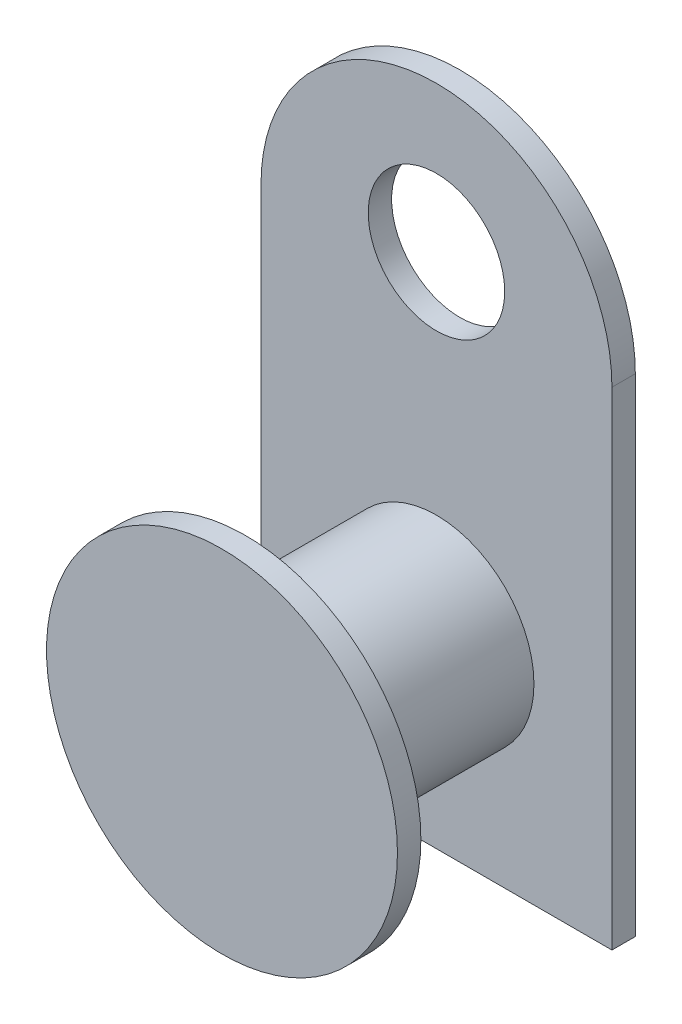
ISO-10303-21;
HEADER;
FILE_DESCRIPTION(('STEP AP214'),'2;1');
FILE_NAME('part.step','',(''),(''),'','','');
FILE_SCHEMA(('AUTOMOTIVE_DESIGN { 1 0 10303 214 1 1 1 1 }'));
ENDSEC;
DATA;
#1=APPLICATION_CONTEXT('core data for automotive mechanical design processes');
#2=APPLICATION_PROTOCOL_DEFINITION('international standard','automotive_design',2000,#1);
#3=PRODUCT_CONTEXT('',#1,'mechanical');
#4=PRODUCT('Part','Part','',(#3));
#5=PRODUCT_RELATED_PRODUCT_CATEGORY('part','',(#4));
#6=PRODUCT_DEFINITION_FORMATION('','',#4);
#7=PRODUCT_DEFINITION_CONTEXT('part definition',#1,'design');
#8=PRODUCT_DEFINITION('design','',#6,#7);
#9=PRODUCT_DEFINITION_SHAPE('','',#8);
#10=(LENGTH_UNIT() NAMED_UNIT(*) SI_UNIT(.MILLI.,.METRE.));
#11=(NAMED_UNIT(*) PLANE_ANGLE_UNIT() SI_UNIT($,.RADIAN.));
#12=(NAMED_UNIT(*) SI_UNIT($,.STERADIAN.) SOLID_ANGLE_UNIT());
#13=UNCERTAINTY_MEASURE_WITH_UNIT(LENGTH_MEASURE(1.E-05),#10,'distance_accuracy_value','');
#14=(GEOMETRIC_REPRESENTATION_CONTEXT(3) GLOBAL_UNCERTAINTY_ASSIGNED_CONTEXT((#13)) GLOBAL_UNIT_ASSIGNED_CONTEXT((#10,
#11,#12)) REPRESENTATION_CONTEXT('',''));
#15=CARTESIAN_POINT('',(0.,0.,0.));
#16=DIRECTION('',(0.,0.,1.));
#17=DIRECTION('',(1.,0.,0.));
#18=AXIS2_PLACEMENT_3D('',#15,#16,#17);
#19=CARTESIAN_POINT('',(0.,49.0988885855391,61.));
#20=DIRECTION('',(0.,0.,-1.));
#21=DIRECTION('',(-1.,0.,0.));
#22=AXIS2_PLACEMENT_3D('',#19,#20,#21);
#23=CYLINDRICAL_SURFACE('',#22,45.);
#24=CARTESIAN_POINT('',(0.,49.0988885855391,61.));
#25=DIRECTION('',(0.,0.,1.));
#26=DIRECTION('',(1.,0.,0.));
#27=AXIS2_PLACEMENT_3D('',#24,#25,#26);
#28=CIRCLE('',#27,45.);
#29=CARTESIAN_POINT('',(45.,49.0988885855391,61.));
#30=VERTEX_POINT('',#29);
#31=EDGE_CURVE('E11',#30,#30,#28,.T.);
#32=ORIENTED_EDGE('',*,*,#31,.F.);
#33=EDGE_LOOP('',(#32));
#34=FACE_BOUND('',#33,.T.);
#35=CARTESIAN_POINT('',(0.,49.0988885855391,55.));
#36=DIRECTION('',(0.,0.,1.));
#37=DIRECTION('',(1.,0.,0.));
#38=AXIS2_PLACEMENT_3D('',#35,#36,#37);
#39=CIRCLE('',#38,45.);
#40=CARTESIAN_POINT('',(45.,49.0988885855391,55.));
#41=VERTEX_POINT('',#40);
#42=EDGE_CURVE('E47',#41,#41,#39,.T.);
#43=ORIENTED_EDGE('',*,*,#42,.T.);
#44=EDGE_LOOP('',(#43));
#45=FACE_BOUND('',#44,.T.);
#46=ADVANCED_FACE('F44',(#34,#45),#23,.T.);
#47=CARTESIAN_POINT('',(0.,49.0988885855391,61.));
#48=DIRECTION('',(0.,0.,1.));
#49=DIRECTION('',(1.,0.,0.));
#50=AXIS2_PLACEMENT_3D('',#47,#48,#49);
#51=PLANE('',#50);
#52=ORIENTED_EDGE('',*,*,#31,.T.);
#53=EDGE_LOOP('',(#52));
#54=FACE_BOUND('',#53,.T.);
#55=ADVANCED_FACE('F59',(#54),#51,.T.);
#56=CARTESIAN_POINT('',(0.,49.0988885855391,55.));
#57=DIRECTION('',(0.,0.,1.));
#58=DIRECTION('',(1.,0.,0.));
#59=AXIS2_PLACEMENT_3D('',#56,#57,#58);
#60=PLANE('',#59);
#61=ORIENTED_EDGE('',*,*,#42,.F.);
#62=EDGE_LOOP('',(#61));
#63=FACE_BOUND('',#62,.T.);
#64=ADVANCED_FACE('F57',(#63),#60,.F.);
#65=CLOSED_SHELL('',(#46,#55,#64));
#66=MANIFOLD_SOLID_BREP('B2',#65);
#67=CARTESIAN_POINT('',(0.,49.0988885855391,58.));
#68=DIRECTION('',(0.,0.,1.));
#69=DIRECTION('',(1.,0.,0.));
#70=AXIS2_PLACEMENT_3D('',#67,#68,#69);
#71=PLANE('',#70);
#72=CARTESIAN_POINT('',(0.,49.0988885855391,58.));
#73=DIRECTION('',(0.,0.,1.));
#74=DIRECTION('',(1.,0.,0.));
#75=AXIS2_PLACEMENT_3D('',#72,#73,#74);
#76=CIRCLE('',#75,25.);
#77=CARTESIAN_POINT('',(25.,49.0988885855391,58.));
#78=VERTEX_POINT('',#77);
#79=EDGE_CURVE('E43',#78,#78,#76,.T.);
#80=ORIENTED_EDGE('',*,*,#79,.T.);
#81=EDGE_LOOP('',(#80));
#82=FACE_BOUND('',#81,.T.);
#83=CARTESIAN_POINT('',(0.,49.0988885855391,58.));
#84=DIRECTION('',(0.,0.,1.));
#85=DIRECTION('',(1.,0.,0.));
#86=AXIS2_PLACEMENT_3D('',#83,#84,#85);
#87=CIRCLE('',#86,22.);
#88=CARTESIAN_POINT('',(22.,49.0988885855391,58.));
#89=VERTEX_POINT('',#88);
#90=EDGE_CURVE('E105',#89,#89,#87,.T.);
#91=ORIENTED_EDGE('',*,*,#90,.F.);
#92=EDGE_LOOP('',(#91));
#93=FACE_BOUND('',#92,.T.);
#94=ADVANCED_FACE('F94',(#82,#93),#71,.T.);
#95=CARTESIAN_POINT('',(0.,49.0988885855391,3.));
#96=DIRECTION('',(0.,0.,1.));
#97=DIRECTION('',(1.,0.,0.));
#98=AXIS2_PLACEMENT_3D('',#95,#96,#97);
#99=PLANE('',#98);
#100=CARTESIAN_POINT('',(0.,49.0988885855391,3.));
#101=DIRECTION('',(0.,0.,1.));
#102=DIRECTION('',(1.,0.,0.));
#103=AXIS2_PLACEMENT_3D('',#100,#101,#102);
#104=CIRCLE('',#103,25.);
#105=CARTESIAN_POINT('',(25.,49.0988885855391,3.));
#106=VERTEX_POINT('',#105);
#107=EDGE_CURVE('E98',#106,#106,#104,.T.);
#108=ORIENTED_EDGE('',*,*,#107,.F.);
#109=EDGE_LOOP('',(#108));
#110=FACE_BOUND('',#109,.T.);
#111=CARTESIAN_POINT('',(0.,49.0988885855391,3.));
#112=DIRECTION('',(0.,0.,1.));
#113=DIRECTION('',(1.,0.,0.));
#114=AXIS2_PLACEMENT_3D('',#111,#112,#113);
#115=CIRCLE('',#114,22.);
#116=CARTESIAN_POINT('',(22.,49.0988885855391,3.));
#117=VERTEX_POINT('',#116);
#118=EDGE_CURVE('E107',#117,#117,#115,.T.);
#119=ORIENTED_EDGE('',*,*,#118,.T.);
#120=EDGE_LOOP('',(#119));
#121=FACE_BOUND('',#120,.T.);
#122=ADVANCED_FACE('F117',(#110,#121),#99,.F.);
#123=CARTESIAN_POINT('',(0.,49.0988885855391,58.));
#124=DIRECTION('',(0.,0.,-1.));
#125=DIRECTION('',(-1.,0.,0.));
#126=AXIS2_PLACEMENT_3D('',#123,#124,#125);
#127=CYLINDRICAL_SURFACE('',#126,25.);
#128=ORIENTED_EDGE('',*,*,#79,.F.);
#129=EDGE_LOOP('',(#128));
#130=FACE_BOUND('',#129,.T.);
#131=ORIENTED_EDGE('',*,*,#107,.T.);
#132=EDGE_LOOP('',(#131));
#133=FACE_BOUND('',#132,.T.);
#134=ADVANCED_FACE('F96',(#130,#133),#127,.T.);
#135=CARTESIAN_POINT('',(0.,49.0988885855391,58.));
#136=DIRECTION('',(0.,0.,-1.));
#137=DIRECTION('',(-1.,0.,0.));
#138=AXIS2_PLACEMENT_3D('',#135,#136,#137);
#139=CYLINDRICAL_SURFACE('',#138,22.);
#140=ORIENTED_EDGE('',*,*,#90,.T.);
#141=EDGE_LOOP('',(#140));
#142=FACE_BOUND('',#141,.T.);
#143=ORIENTED_EDGE('',*,*,#118,.F.);
#144=EDGE_LOOP('',(#143));
#145=FACE_BOUND('',#144,.T.);
#146=ADVANCED_FACE('F113',(#142,#145),#139,.F.);
#147=CLOSED_SHELL('',(#94,#122,#134,#146));
#148=MANIFOLD_SOLID_BREP('B6',#147);
#149=CARTESIAN_POINT('',(0.,125.,6.));
#150=DIRECTION('',(0.,0.,1.));
#151=DIRECTION('',(1.,0.,0.));
#152=AXIS2_PLACEMENT_3D('',#149,#150,#151);
#153=PLANE('',#152);
#154=CARTESIAN_POINT('',(0.,49.0988885855391,6.));
#155=DIRECTION('',(0.,0.,1.));
#156=DIRECTION('',(1.,0.,0.));
#157=AXIS2_PLACEMENT_3D('',#154,#155,#156);
#158=CIRCLE('',#157,25.);
#159=CARTESIAN_POINT('',(25.,49.0988885855391,6.));
#160=VERTEX_POINT('',#159);
#161=EDGE_CURVE('E240',#160,#160,#158,.T.);
#162=ORIENTED_EDGE('',*,*,#161,.F.);
#163=EDGE_LOOP('',(#162));
#164=FACE_BOUND('',#163,.T.);
#165=DIRECTION('',(0.,-1.,0.));
#166=VECTOR('',#165,1.);
#167=CARTESIAN_POINT('',(-45.,125.,6.));
#168=LINE('',#167,#166);
#169=CARTESIAN_POINT('',(-45.,125.,6.));
#170=VERTEX_POINT('',#169);
#171=CARTESIAN_POINT('',(-45.,0.,6.));
#172=VERTEX_POINT('',#171);
#173=EDGE_CURVE('E207',#170,#172,#168,.T.);
#174=ORIENTED_EDGE('',*,*,#173,.T.);
#175=DIRECTION('',(1.,0.,0.));
#176=VECTOR('',#175,1.);
#177=CARTESIAN_POINT('',(-45.,0.,6.));
#178=LINE('',#177,#176);
#179=CARTESIAN_POINT('',(45.,0.,6.));
#180=VERTEX_POINT('',#179);
#181=EDGE_CURVE('E202',#172,#180,#178,.T.);
#182=ORIENTED_EDGE('',*,*,#181,.T.);
#183=DIRECTION('',(0.,1.,0.));
#184=VECTOR('',#183,1.);
#185=CARTESIAN_POINT('',(45.,0.,6.));
#186=LINE('',#185,#184);
#187=CARTESIAN_POINT('',(45.,125.,6.));
#188=VERTEX_POINT('',#187);
#189=EDGE_CURVE('E205',#180,#188,#186,.T.);
#190=ORIENTED_EDGE('',*,*,#189,.T.);
#191=CARTESIAN_POINT('',(0.,125.,6.));
#192=DIRECTION('',(0.,0.,1.));
#193=DIRECTION('',(1.,0.,0.));
#194=AXIS2_PLACEMENT_3D('',#191,#192,#193);
#195=CIRCLE('',#194,45.);
#196=EDGE_CURVE('E172',#188,#170,#195,.T.);
#197=ORIENTED_EDGE('',*,*,#196,.T.);
#198=EDGE_LOOP('',(#174,#182,#190,#197));
#199=FACE_BOUND('',#198,.T.);
#200=CARTESIAN_POINT('',(0.,132.5,6.));
#201=DIRECTION('',(0.,0.,1.));
#202=DIRECTION('',(1.,0.,0.));
#203=AXIS2_PLACEMENT_3D('',#200,#201,#202);
#204=CIRCLE('',#203,17.5);
#205=CARTESIAN_POINT('',(17.5,132.5,6.));
#206=VERTEX_POINT('',#205);
#207=EDGE_CURVE('E222',#206,#206,#204,.T.);
#208=ORIENTED_EDGE('',*,*,#207,.F.);
#209=EDGE_LOOP('',(#208));
#210=FACE_BOUND('',#209,.T.);
#211=ADVANCED_FACE('F155',(#164,#199,#210),#153,.T.);
#212=CARTESIAN_POINT('',(0.,125.,0.));
#213=DIRECTION('',(0.,0.,1.));
#214=DIRECTION('',(1.,0.,0.));
#215=AXIS2_PLACEMENT_3D('',#212,#213,#214);
#216=PLANE('',#215);
#217=DIRECTION('',(0.,-1.,0.));
#218=VECTOR('',#217,1.);
#219=CARTESIAN_POINT('',(-45.,125.,0.));
#220=LINE('',#219,#218);
#221=CARTESIAN_POINT('',(-45.,125.,0.));
#222=VERTEX_POINT('',#221);
#223=CARTESIAN_POINT('',(-45.,0.,0.));
#224=VERTEX_POINT('',#223);
#225=EDGE_CURVE('E219',#222,#224,#220,.T.);
#226=ORIENTED_EDGE('',*,*,#225,.F.);
#227=CARTESIAN_POINT('',(0.,125.,0.));
#228=DIRECTION('',(0.,0.,1.));
#229=DIRECTION('',(1.,0.,0.));
#230=AXIS2_PLACEMENT_3D('',#227,#228,#229);
#231=CIRCLE('',#230,45.);
#232=CARTESIAN_POINT('',(45.,125.,0.));
#233=VERTEX_POINT('',#232);
#234=EDGE_CURVE('E195',#233,#222,#231,.T.);
#235=ORIENTED_EDGE('',*,*,#234,.F.);
#236=DIRECTION('',(0.,1.,0.));
#237=VECTOR('',#236,1.);
#238=CARTESIAN_POINT('',(45.,0.,0.));
#239=LINE('',#238,#237);
#240=CARTESIAN_POINT('',(45.,0.,0.));
#241=VERTEX_POINT('',#240);
#242=EDGE_CURVE('E189',#241,#233,#239,.T.);
#243=ORIENTED_EDGE('',*,*,#242,.F.);
#244=DIRECTION('',(1.,0.,0.));
#245=VECTOR('',#244,1.);
#246=CARTESIAN_POINT('',(-45.,0.,0.));
#247=LINE('',#246,#245);
#248=EDGE_CURVE('E211',#224,#241,#247,.T.);
#249=ORIENTED_EDGE('',*,*,#248,.F.);
#250=EDGE_LOOP('',(#226,#235,#243,#249));
#251=FACE_BOUND('',#250,.T.);
#252=CARTESIAN_POINT('',(0.,132.5,0.));
#253=DIRECTION('',(0.,0.,1.));
#254=DIRECTION('',(1.,0.,0.));
#255=AXIS2_PLACEMENT_3D('',#252,#253,#254);
#256=CIRCLE('',#255,17.5);
#257=CARTESIAN_POINT('',(17.5,132.5,0.));
#258=VERTEX_POINT('',#257);
#259=EDGE_CURVE('E234',#258,#258,#256,.T.);
#260=ORIENTED_EDGE('',*,*,#259,.T.);
#261=EDGE_LOOP('',(#260));
#262=FACE_BOUND('',#261,.T.);
#263=ADVANCED_FACE('F230',(#251,#262),#216,.F.);
#264=CARTESIAN_POINT('',(-45.,125.,6.));
#265=DIRECTION('',(1.,0.,0.));
#266=DIRECTION('',(0.,1.,0.));
#267=AXIS2_PLACEMENT_3D('',#264,#265,#266);
#268=PLANE('',#267);
#269=ORIENTED_EDGE('',*,*,#225,.T.);
#270=DIRECTION('',(0.,0.,-1.));
#271=VECTOR('',#270,1.);
#272=CARTESIAN_POINT('',(-45.,0.,6.));
#273=LINE('',#272,#271);
#274=EDGE_CURVE('E92',#172,#224,#273,.T.);
#275=ORIENTED_EDGE('',*,*,#274,.F.);
#276=ORIENTED_EDGE('',*,*,#173,.F.);
#277=DIRECTION('',(0.,0.,-1.));
#278=VECTOR('',#277,1.);
#279=CARTESIAN_POINT('',(-45.,125.,6.));
#280=LINE('',#279,#278);
#281=EDGE_CURVE('E215',#170,#222,#280,.T.);
#282=ORIENTED_EDGE('',*,*,#281,.T.);
#283=EDGE_LOOP('',(#269,#275,#276,#282));
#284=FACE_BOUND('',#283,.T.);
#285=ADVANCED_FACE('F157',(#284),#268,.F.);
#286=CARTESIAN_POINT('',(-45.,0.,6.));
#287=DIRECTION('',(0.,1.,0.));
#288=DIRECTION('',(0.,0.,1.));
#289=AXIS2_PLACEMENT_3D('',#286,#287,#288);
#290=PLANE('',#289);
#291=ORIENTED_EDGE('',*,*,#248,.T.);
#292=DIRECTION('',(0.,0.,-1.));
#293=VECTOR('',#292,1.);
#294=CARTESIAN_POINT('',(45.,0.,6.));
#295=LINE('',#294,#293);
#296=EDGE_CURVE('E164',#180,#241,#295,.T.);
#297=ORIENTED_EDGE('',*,*,#296,.F.);
#298=ORIENTED_EDGE('',*,*,#181,.F.);
#299=ORIENTED_EDGE('',*,*,#274,.T.);
#300=EDGE_LOOP('',(#291,#297,#298,#299));
#301=FACE_BOUND('',#300,.T.);
#302=ADVANCED_FACE('F210',(#301),#290,.F.);
#303=CARTESIAN_POINT('',(45.,0.,6.));
#304=DIRECTION('',(-1.,0.,0.));
#305=DIRECTION('',(0.,-1.,0.));
#306=AXIS2_PLACEMENT_3D('',#303,#304,#305);
#307=PLANE('',#306);
#308=ORIENTED_EDGE('',*,*,#242,.T.);
#309=DIRECTION('',(0.,0.,-1.));
#310=VECTOR('',#309,1.);
#311=CARTESIAN_POINT('',(45.,125.,6.));
#312=LINE('',#311,#310);
#313=EDGE_CURVE('E212',#188,#233,#312,.T.);
#314=ORIENTED_EDGE('',*,*,#313,.F.);
#315=ORIENTED_EDGE('',*,*,#189,.F.);
#316=ORIENTED_EDGE('',*,*,#296,.T.);
#317=EDGE_LOOP('',(#308,#314,#315,#316));
#318=FACE_BOUND('',#317,.T.);
#319=ADVANCED_FACE('F213',(#318),#307,.F.);
#320=CARTESIAN_POINT('',(0.,125.,6.));
#321=DIRECTION('',(0.,0.,-1.));
#322=DIRECTION('',(-1.,0.,0.));
#323=AXIS2_PLACEMENT_3D('',#320,#321,#322);
#324=CYLINDRICAL_SURFACE('',#323,45.);
#325=ORIENTED_EDGE('',*,*,#234,.T.);
#326=ORIENTED_EDGE('',*,*,#281,.F.);
#327=ORIENTED_EDGE('',*,*,#196,.F.);
#328=ORIENTED_EDGE('',*,*,#313,.T.);
#329=EDGE_LOOP('',(#325,#326,#327,#328));
#330=FACE_BOUND('',#329,.T.);
#331=ADVANCED_FACE('F227',(#330),#324,.T.);
#332=CARTESIAN_POINT('',(0.,132.5,6.));
#333=DIRECTION('',(0.,0.,-1.));
#334=DIRECTION('',(-1.,0.,0.));
#335=AXIS2_PLACEMENT_3D('',#332,#333,#334);
#336=CYLINDRICAL_SURFACE('',#335,17.5);
#337=ORIENTED_EDGE('',*,*,#207,.T.);
#338=EDGE_LOOP('',(#337));
#339=FACE_BOUND('',#338,.T.);
#340=ORIENTED_EDGE('',*,*,#259,.F.);
#341=EDGE_LOOP('',(#340));
#342=FACE_BOUND('',#341,.T.);
#343=ADVANCED_FACE('F264',(#339,#342),#336,.F.);
#344=CARTESIAN_POINT('',(0.,49.0988885855391,3.));
#345=DIRECTION('',(0.,0.,1.));
#346=DIRECTION('',(1.,0.,0.));
#347=AXIS2_PLACEMENT_3D('',#344,#345,#346);
#348=CYLINDRICAL_SURFACE('',#347,25.);
#349=CARTESIAN_POINT('',(0.,49.0988885855391,3.));
#350=DIRECTION('',(0.,0.,1.));
#351=DIRECTION('',(1.,0.,0.));
#352=AXIS2_PLACEMENT_3D('',#349,#350,#351);
#353=CIRCLE('',#352,25.);
#354=CARTESIAN_POINT('',(25.,49.0988885855391,3.));
#355=VERTEX_POINT('',#354);
#356=EDGE_CURVE('E237',#355,#355,#353,.T.);
#357=ORIENTED_EDGE('',*,*,#356,.F.);
#358=EDGE_LOOP('',(#357));
#359=FACE_BOUND('',#358,.T.);
#360=ORIENTED_EDGE('',*,*,#161,.T.);
#361=EDGE_LOOP('',(#360));
#362=FACE_BOUND('',#361,.T.);
#363=ADVANCED_FACE('F258',(#359,#362),#348,.F.);
#364=CARTESIAN_POINT('',(0.,49.0988885855391,3.));
#365=DIRECTION('',(0.,0.,1.));
#366=DIRECTION('',(1.,0.,0.));
#367=AXIS2_PLACEMENT_3D('',#364,#365,#366);
#368=PLANE('',#367);
#369=CARTESIAN_POINT('',(0.,49.0988885855391,3.));
#370=DIRECTION('',(0.,0.,1.));
#371=DIRECTION('',(1.,0.,0.));
#372=AXIS2_PLACEMENT_3D('',#369,#370,#371);
#373=CIRCLE('',#372,22.);
#374=CARTESIAN_POINT('',(22.,49.0988885855391,3.));
#375=VERTEX_POINT('',#374);
#376=EDGE_CURVE('E243',#375,#375,#373,.T.);
#377=ORIENTED_EDGE('',*,*,#376,.F.);
#378=EDGE_LOOP('',(#377));
#379=FACE_BOUND('',#378,.T.);
#380=ORIENTED_EDGE('',*,*,#356,.T.);
#381=EDGE_LOOP('',(#380));
#382=FACE_BOUND('',#381,.T.);
#383=ADVANCED_FACE('F255',(#379,#382),#368,.T.);
#384=CARTESIAN_POINT('',(0.,49.0988885855391,3.));
#385=DIRECTION('',(0.,0.,1.));
#386=DIRECTION('',(1.,0.,0.));
#387=AXIS2_PLACEMENT_3D('',#384,#385,#386);
#388=CYLINDRICAL_SURFACE('',#387,22.);
#389=ORIENTED_EDGE('',*,*,#376,.T.);
#390=EDGE_LOOP('',(#389));
#391=FACE_BOUND('',#390,.T.);
#392=CARTESIAN_POINT('',(0.,49.0988885855391,6.));
#393=DIRECTION('',(0.,0.,1.));
#394=DIRECTION('',(1.,0.,0.));
#395=AXIS2_PLACEMENT_3D('',#392,#393,#394);
#396=CIRCLE('',#395,22.);
#397=CARTESIAN_POINT('',(22.,49.0988885855391,6.));
#398=VERTEX_POINT('',#397);
#399=EDGE_CURVE('E246',#398,#398,#396,.T.);
#400=ORIENTED_EDGE('',*,*,#399,.F.);
#401=EDGE_LOOP('',(#400));
#402=FACE_BOUND('',#401,.T.);
#403=ADVANCED_FACE('F252',(#391,#402),#388,.T.);
#404=ORIENTED_EDGE('',*,*,#399,.T.);
#405=EDGE_LOOP('',(#404));
#406=FACE_BOUND('',#405,.T.);
#407=ADVANCED_FACE('F270',(#406),#153,.T.);
#408=CLOSED_SHELL('',(#211,#263,#285,#302,#319,#331,#343,#363,#383,#403,#407));
#409=MANIFOLD_SOLID_BREP('B38',#408);
#410=ADVANCED_BREP_SHAPE_REPRESENTATION('',(#18,#66,#148,#409),#14);
#411=SHAPE_DEFINITION_REPRESENTATION(#9,#410);
ENDSEC;
END-ISO-10303-21;
